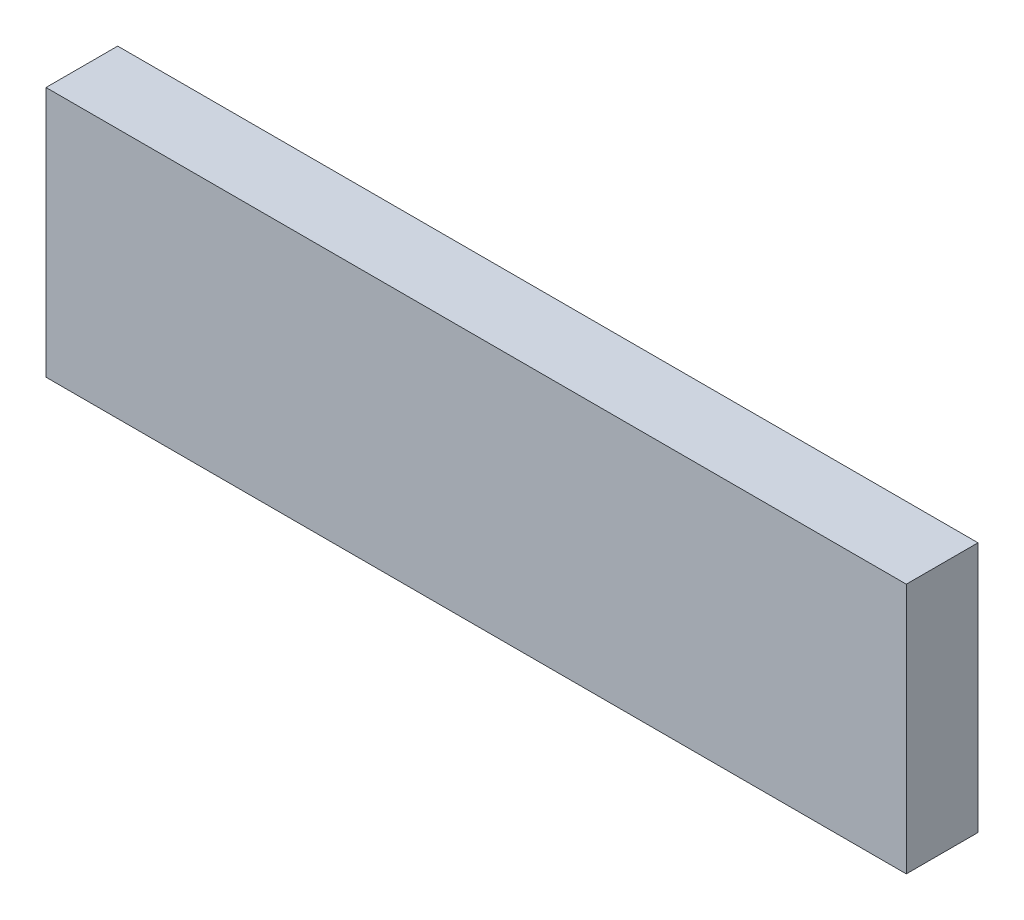
ISO-10303-21;
HEADER;
FILE_DESCRIPTION(('STEP AP214'),'2;1');
FILE_NAME('part.step','',(''),(''),'','','');
FILE_SCHEMA(('AUTOMOTIVE_DESIGN { 1 0 10303 214 1 1 1 1 }'));
ENDSEC;
DATA;
#1=APPLICATION_CONTEXT('core data for automotive mechanical design processes');
#2=APPLICATION_PROTOCOL_DEFINITION('international standard','automotive_design',2000,#1);
#3=PRODUCT_CONTEXT('',#1,'mechanical');
#4=PRODUCT('Part','Part','',(#3));
#5=PRODUCT_RELATED_PRODUCT_CATEGORY('part','',(#4));
#6=PRODUCT_DEFINITION_FORMATION('','',#4);
#7=PRODUCT_DEFINITION_CONTEXT('part definition',#1,'design');
#8=PRODUCT_DEFINITION('design','',#6,#7);
#9=PRODUCT_DEFINITION_SHAPE('','',#8);
#10=(LENGTH_UNIT() NAMED_UNIT(*) SI_UNIT(.MILLI.,.METRE.));
#11=(NAMED_UNIT(*) PLANE_ANGLE_UNIT() SI_UNIT($,.RADIAN.));
#12=(NAMED_UNIT(*) SI_UNIT($,.STERADIAN.) SOLID_ANGLE_UNIT());
#13=UNCERTAINTY_MEASURE_WITH_UNIT(LENGTH_MEASURE(1.E-05),#10,'distance_accuracy_value','');
#14=(GEOMETRIC_REPRESENTATION_CONTEXT(3) GLOBAL_UNCERTAINTY_ASSIGNED_CONTEXT((#13)) GLOBAL_UNIT_ASSIGNED_CONTEXT((#10,
#11,#12)) REPRESENTATION_CONTEXT('',''));
#15=CARTESIAN_POINT('',(0.,0.,0.));
#16=DIRECTION('',(0.,0.,1.));
#17=DIRECTION('',(1.,0.,0.));
#18=AXIS2_PLACEMENT_3D('',#15,#16,#17);
#19=CARTESIAN_POINT('',(120.,-35.,20.));
#20=DIRECTION('',(-1.,0.,0.));
#21=DIRECTION('',(0.,0.,1.));
#22=AXIS2_PLACEMENT_3D('',#19,#20,#21);
#23=PLANE('',#22);
#24=DIRECTION('',(0.,1.,0.));
#25=VECTOR('',#24,1.);
#26=CARTESIAN_POINT('',(120.,-35.,0.));
#27=LINE('',#26,#25);
#28=CARTESIAN_POINT('',(120.,-35.,0.));
#29=VERTEX_POINT('',#28);
#30=CARTESIAN_POINT('',(120.,35.,0.));
#31=VERTEX_POINT('',#30);
#32=EDGE_CURVE('E113',#29,#31,#27,.T.);
#33=ORIENTED_EDGE('',*,*,#32,.T.);
#34=DIRECTION('',(0.,0.,-1.));
#35=VECTOR('',#34,1.);
#36=CARTESIAN_POINT('',(120.,35.,20.));
#37=LINE('',#36,#35);
#38=CARTESIAN_POINT('',(120.,35.,20.));
#39=VERTEX_POINT('',#38);
#40=EDGE_CURVE('E11',#39,#31,#37,.T.);
#41=ORIENTED_EDGE('',*,*,#40,.F.);
#42=DIRECTION('',(0.,1.,0.));
#43=VECTOR('',#42,1.);
#44=CARTESIAN_POINT('',(120.,-35.,20.));
#45=LINE('',#44,#43);
#46=CARTESIAN_POINT('',(120.,-35.,20.));
#47=VERTEX_POINT('',#46);
#48=EDGE_CURVE('E97',#47,#39,#45,.T.);
#49=ORIENTED_EDGE('',*,*,#48,.F.);
#50=DIRECTION('',(0.,0.,-1.));
#51=VECTOR('',#50,1.);
#52=CARTESIAN_POINT('',(120.,-35.,20.));
#53=LINE('',#52,#51);
#54=EDGE_CURVE('E109',#47,#29,#53,.T.);
#55=ORIENTED_EDGE('',*,*,#54,.T.);
#56=EDGE_LOOP('',(#33,#41,#49,#55));
#57=FACE_BOUND('',#56,.T.);
#58=ADVANCED_FACE('F45',(#57),#23,.F.);
#59=CARTESIAN_POINT('',(-120.,35.,20.));
#60=DIRECTION('',(0.,-1.,0.));
#61=DIRECTION('',(0.,0.,-1.));
#62=AXIS2_PLACEMENT_3D('',#59,#60,#61);
#63=PLANE('',#62);
#64=DIRECTION('',(-1.,0.,0.));
#65=VECTOR('',#64,1.);
#66=CARTESIAN_POINT('',(-120.,35.,0.));
#67=LINE('',#66,#65);
#68=CARTESIAN_POINT('',(-120.,35.,0.));
#69=VERTEX_POINT('',#68);
#70=EDGE_CURVE('E102',#31,#69,#67,.T.);
#71=ORIENTED_EDGE('',*,*,#70,.T.);
#72=DIRECTION('',(0.,0.,-1.));
#73=VECTOR('',#72,1.);
#74=CARTESIAN_POINT('',(-120.,35.,20.));
#75=LINE('',#74,#73);
#76=CARTESIAN_POINT('',(-120.,35.,20.));
#77=VERTEX_POINT('',#76);
#78=EDGE_CURVE('E54',#77,#69,#75,.T.);
#79=ORIENTED_EDGE('',*,*,#78,.F.);
#80=DIRECTION('',(-1.,0.,0.));
#81=VECTOR('',#80,1.);
#82=CARTESIAN_POINT('',(-120.,35.,20.));
#83=LINE('',#82,#81);
#84=EDGE_CURVE('E92',#39,#77,#83,.T.);
#85=ORIENTED_EDGE('',*,*,#84,.F.);
#86=ORIENTED_EDGE('',*,*,#40,.T.);
#87=EDGE_LOOP('',(#71,#79,#85,#86));
#88=FACE_BOUND('',#87,.T.);
#89=ADVANCED_FACE('F101',(#88),#63,.F.);
#90=CARTESIAN_POINT('',(-120.,-35.,20.));
#91=DIRECTION('',(1.,0.,0.));
#92=DIRECTION('',(0.,0.,-1.));
#93=AXIS2_PLACEMENT_3D('',#90,#91,#92);
#94=PLANE('',#93);
#95=DIRECTION('',(0.,-1.,0.));
#96=VECTOR('',#95,1.);
#97=CARTESIAN_POINT('',(-120.,-35.,0.));
#98=LINE('',#97,#96);
#99=CARTESIAN_POINT('',(-120.,-35.,0.));
#100=VERTEX_POINT('',#99);
#101=EDGE_CURVE('E79',#69,#100,#98,.T.);
#102=ORIENTED_EDGE('',*,*,#101,.T.);
#103=DIRECTION('',(0.,0.,-1.));
#104=VECTOR('',#103,1.);
#105=CARTESIAN_POINT('',(-120.,-35.,20.));
#106=LINE('',#105,#104);
#107=CARTESIAN_POINT('',(-120.,-35.,20.));
#108=VERTEX_POINT('',#107);
#109=EDGE_CURVE('E104',#108,#100,#106,.T.);
#110=ORIENTED_EDGE('',*,*,#109,.F.);
#111=DIRECTION('',(0.,-1.,0.));
#112=VECTOR('',#111,1.);
#113=CARTESIAN_POINT('',(-120.,-35.,20.));
#114=LINE('',#113,#112);
#115=EDGE_CURVE('E95',#77,#108,#114,.T.);
#116=ORIENTED_EDGE('',*,*,#115,.F.);
#117=ORIENTED_EDGE('',*,*,#78,.T.);
#118=EDGE_LOOP('',(#102,#110,#116,#117));
#119=FACE_BOUND('',#118,.T.);
#120=ADVANCED_FACE('F105',(#119),#94,.F.);
#121=CARTESIAN_POINT('',(-120.,-35.,20.));
#122=DIRECTION('',(0.,1.,0.));
#123=DIRECTION('',(0.,0.,1.));
#124=AXIS2_PLACEMENT_3D('',#121,#122,#123);
#125=PLANE('',#124);
#126=DIRECTION('',(1.,0.,0.));
#127=VECTOR('',#126,1.);
#128=CARTESIAN_POINT('',(-120.,-35.,0.));
#129=LINE('',#128,#127);
#130=EDGE_CURVE('E85',#100,#29,#129,.T.);
#131=ORIENTED_EDGE('',*,*,#130,.T.);
#132=ORIENTED_EDGE('',*,*,#54,.F.);
#133=DIRECTION('',(1.,0.,0.));
#134=VECTOR('',#133,1.);
#135=CARTESIAN_POINT('',(-120.,-35.,20.));
#136=LINE('',#135,#134);
#137=EDGE_CURVE('E62',#108,#47,#136,.T.);
#138=ORIENTED_EDGE('',*,*,#137,.F.);
#139=ORIENTED_EDGE('',*,*,#109,.T.);
#140=EDGE_LOOP('',(#131,#132,#138,#139));
#141=FACE_BOUND('',#140,.T.);
#142=ADVANCED_FACE('F126',(#141),#125,.F.);
#143=CARTESIAN_POINT('',(0.,0.,20.));
#144=DIRECTION('',(0.,0.,-1.));
#145=DIRECTION('',(-1.,0.,0.));
#146=AXIS2_PLACEMENT_3D('',#143,#144,#145);
#147=PLANE('',#146);
#148=ORIENTED_EDGE('',*,*,#48,.T.);
#149=ORIENTED_EDGE('',*,*,#84,.T.);
#150=ORIENTED_EDGE('',*,*,#115,.T.);
#151=ORIENTED_EDGE('',*,*,#137,.T.);
#152=EDGE_LOOP('',(#148,#149,#150,#151));
#153=FACE_BOUND('',#152,.T.);
#154=ADVANCED_FACE('F93',(#153),#147,.F.);
#155=CARTESIAN_POINT('',(0.,0.,0.));
#156=DIRECTION('',(0.,0.,-1.));
#157=DIRECTION('',(-1.,0.,0.));
#158=AXIS2_PLACEMENT_3D('',#155,#156,#157);
#159=PLANE('',#158);
#160=ORIENTED_EDGE('',*,*,#32,.F.);
#161=ORIENTED_EDGE('',*,*,#130,.F.);
#162=ORIENTED_EDGE('',*,*,#101,.F.);
#163=ORIENTED_EDGE('',*,*,#70,.F.);
#164=EDGE_LOOP('',(#160,#161,#162,#163));
#165=FACE_BOUND('',#164,.T.);
#166=ADVANCED_FACE('F129',(#165),#159,.T.);
#167=CLOSED_SHELL('',(#58,#89,#120,#142,#154,#166));
#168=MANIFOLD_SOLID_BREP('B2',#167);
#169=ADVANCED_BREP_SHAPE_REPRESENTATION('',(#18,#168),#14);
#170=SHAPE_DEFINITION_REPRESENTATION(#9,#169);
ENDSEC;
END-ISO-10303-21;
